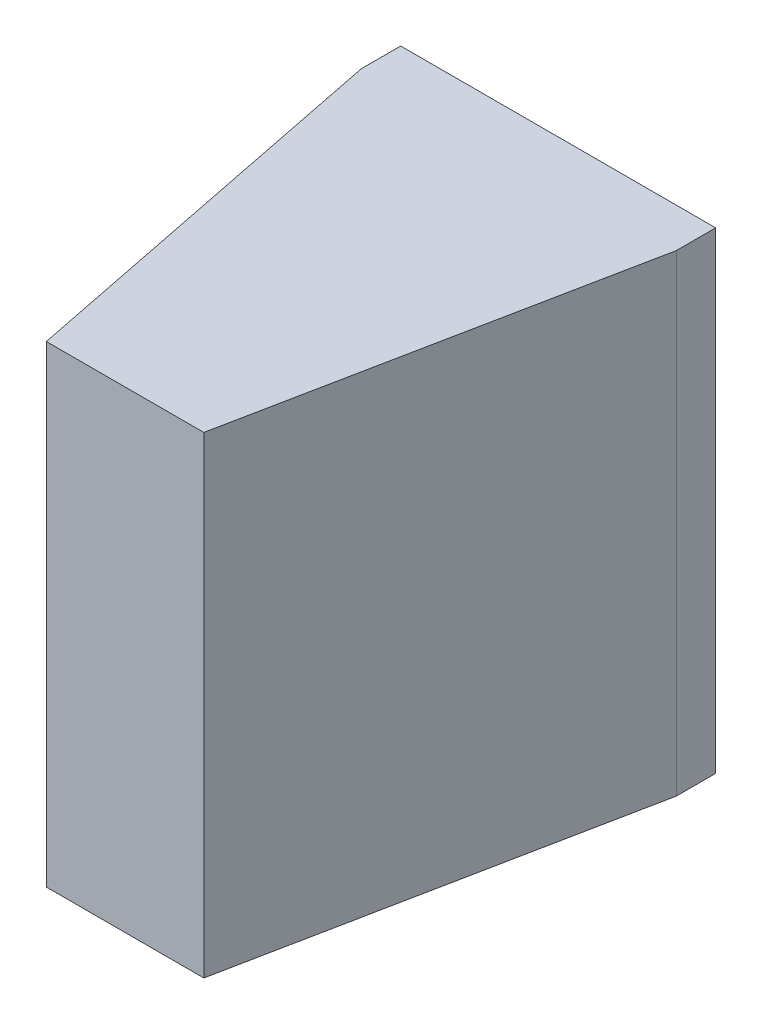
ISO-10303-21;
HEADER;
FILE_DESCRIPTION(('STEP AP214'),'2;1');
FILE_NAME('part.step','',(''),(''),'','','');
FILE_SCHEMA(('AUTOMOTIVE_DESIGN { 1 0 10303 214 1 1 1 1 }'));
ENDSEC;
DATA;
#1=APPLICATION_CONTEXT('core data for automotive mechanical design processes');
#2=APPLICATION_PROTOCOL_DEFINITION('international standard','automotive_design',2000,#1);
#3=PRODUCT_CONTEXT('',#1,'mechanical');
#4=PRODUCT('Part','Part','',(#3));
#5=PRODUCT_RELATED_PRODUCT_CATEGORY('part','',(#4));
#6=PRODUCT_DEFINITION_FORMATION('','',#4);
#7=PRODUCT_DEFINITION_CONTEXT('part definition',#1,'design');
#8=PRODUCT_DEFINITION('design','',#6,#7);
#9=PRODUCT_DEFINITION_SHAPE('','',#8);
#10=(LENGTH_UNIT() NAMED_UNIT(*) SI_UNIT(.MILLI.,.METRE.));
#11=(NAMED_UNIT(*) PLANE_ANGLE_UNIT() SI_UNIT($,.RADIAN.));
#12=(NAMED_UNIT(*) SI_UNIT($,.STERADIAN.) SOLID_ANGLE_UNIT());
#13=UNCERTAINTY_MEASURE_WITH_UNIT(LENGTH_MEASURE(1.E-05),#10,'distance_accuracy_value','');
#14=(GEOMETRIC_REPRESENTATION_CONTEXT(3) GLOBAL_UNCERTAINTY_ASSIGNED_CONTEXT((#13)) GLOBAL_UNIT_ASSIGNED_CONTEXT((#10,
#11,#12)) REPRESENTATION_CONTEXT('',''));
#15=CARTESIAN_POINT('',(0.,0.,0.));
#16=DIRECTION('',(0.,0.,1.));
#17=DIRECTION('',(1.,0.,0.));
#18=AXIS2_PLACEMENT_3D('',#15,#16,#17);
#19=CARTESIAN_POINT('',(40.,-60.,10.));
#20=DIRECTION('',(-1.,0.,0.));
#21=DIRECTION('',(0.,0.,1.));
#22=AXIS2_PLACEMENT_3D('',#19,#20,#21);
#23=PLANE('',#22);
#24=DIRECTION('',(0.,1.,0.));
#25=VECTOR('',#24,1.);
#26=CARTESIAN_POINT('',(40.,-60.,0.));
#27=LINE('',#26,#25);
#28=CARTESIAN_POINT('',(40.,-60.,0.));
#29=VERTEX_POINT('',#28);
#30=CARTESIAN_POINT('',(40.,60.,0.));
#31=VERTEX_POINT('',#30);
#32=EDGE_CURVE('E120',#29,#31,#27,.T.);
#33=ORIENTED_EDGE('',*,*,#32,.T.);
#34=DIRECTION('',(0.,0.,-1.));
#35=VECTOR('',#34,1.);
#36=CARTESIAN_POINT('',(40.,60.,10.));
#37=LINE('',#36,#35);
#38=CARTESIAN_POINT('',(40.,60.,10.));
#39=VERTEX_POINT('',#38);
#40=EDGE_CURVE('E11',#39,#31,#37,.T.);
#41=ORIENTED_EDGE('',*,*,#40,.F.);
#42=DIRECTION('',(0.,1.,0.));
#43=VECTOR('',#42,1.);
#44=CARTESIAN_POINT('',(40.,-60.,10.));
#45=LINE('',#44,#43);
#46=CARTESIAN_POINT('',(40.,-60.,9.99999999999999));
#47=VERTEX_POINT('',#46);
#48=EDGE_CURVE('E127',#47,#39,#45,.T.);
#49=ORIENTED_EDGE('',*,*,#48,.F.);
#50=DIRECTION('',(0.,0.,-1.));
#51=VECTOR('',#50,1.);
#52=CARTESIAN_POINT('',(40.,-60.,10.));
#53=LINE('',#52,#51);
#54=EDGE_CURVE('E131',#47,#29,#53,.T.);
#55=ORIENTED_EDGE('',*,*,#54,.T.);
#56=EDGE_LOOP('',(#33,#41,#49,#55));
#57=FACE_BOUND('',#56,.T.);
#58=ADVANCED_FACE('F39',(#57),#23,.F.);
#59=CARTESIAN_POINT('',(-40.,60.,10.));
#60=DIRECTION('',(0.,-1.,0.));
#61=DIRECTION('',(0.,0.,-1.));
#62=AXIS2_PLACEMENT_3D('',#59,#60,#61);
#63=PLANE('',#62);
#64=DIRECTION('',(-1.,0.,0.));
#65=VECTOR('',#64,1.);
#66=CARTESIAN_POINT('',(-40.,60.,0.));
#67=LINE('',#66,#65);
#68=CARTESIAN_POINT('',(-40.,60.,0.));
#69=VERTEX_POINT('',#68);
#70=EDGE_CURVE('E122',#31,#69,#67,.T.);
#71=ORIENTED_EDGE('',*,*,#70,.T.);
#72=DIRECTION('',(0.,0.,-1.));
#73=VECTOR('',#72,1.);
#74=CARTESIAN_POINT('',(-40.,60.,10.));
#75=LINE('',#74,#73);
#76=CARTESIAN_POINT('',(-40.,60.,10.));
#77=VERTEX_POINT('',#76);
#78=EDGE_CURVE('E47',#77,#69,#75,.T.);
#79=ORIENTED_EDGE('',*,*,#78,.F.);
#80=DIRECTION('',(0.196116135138184,0.,0.98058067569092));
#81=VECTOR('',#80,1.);
#82=CARTESIAN_POINT('',(-40.,60.,10.));
#83=LINE('',#82,#81);
#84=CARTESIAN_POINT('',(-20.,60.,110.));
#85=VERTEX_POINT('',#84);
#86=EDGE_CURVE('E110',#77,#85,#83,.T.);
#87=ORIENTED_EDGE('',*,*,#86,.T.);
#88=DIRECTION('',(1.,0.,0.));
#89=VECTOR('',#88,1.);
#90=CARTESIAN_POINT('',(-20.,60.,110.));
#91=LINE('',#90,#89);
#92=CARTESIAN_POINT('',(20.,60.,110.));
#93=VERTEX_POINT('',#92);
#94=EDGE_CURVE('E99',#85,#93,#91,.T.);
#95=ORIENTED_EDGE('',*,*,#94,.T.);
#96=DIRECTION('',(0.196116135138184,0.,-0.98058067569092));
#97=VECTOR('',#96,1.);
#98=CARTESIAN_POINT('',(40.,60.,9.99999999999999));
#99=LINE('',#98,#97);
#100=EDGE_CURVE('E109',#93,#39,#99,.T.);
#101=ORIENTED_EDGE('',*,*,#100,.T.);
#102=ORIENTED_EDGE('',*,*,#40,.T.);
#103=EDGE_LOOP('',(#71,#79,#87,#95,#101,#102));
#104=FACE_BOUND('',#103,.T.);
#105=ADVANCED_FACE('F113',(#104),#63,.F.);
#106=CARTESIAN_POINT('',(-40.,-60.,10.));
#107=DIRECTION('',(1.,0.,0.));
#108=DIRECTION('',(0.,0.,-1.));
#109=AXIS2_PLACEMENT_3D('',#106,#107,#108);
#110=PLANE('',#109);
#111=DIRECTION('',(0.,-1.,0.));
#112=VECTOR('',#111,1.);
#113=CARTESIAN_POINT('',(-40.,-60.,0.));
#114=LINE('',#113,#112);
#115=CARTESIAN_POINT('',(-40.,-60.,0.));
#116=VERTEX_POINT('',#115);
#117=EDGE_CURVE('E71',#69,#116,#114,.T.);
#118=ORIENTED_EDGE('',*,*,#117,.T.);
#119=DIRECTION('',(0.,0.,-1.));
#120=VECTOR('',#119,1.);
#121=CARTESIAN_POINT('',(-40.,-60.,10.));
#122=LINE('',#121,#120);
#123=CARTESIAN_POINT('',(-40.,-60.,10.));
#124=VERTEX_POINT('',#123);
#125=EDGE_CURVE('E55',#124,#116,#122,.T.);
#126=ORIENTED_EDGE('',*,*,#125,.F.);
#127=DIRECTION('',(0.,-1.,0.));
#128=VECTOR('',#127,1.);
#129=CARTESIAN_POINT('',(-40.,-60.,10.));
#130=LINE('',#129,#128);
#131=EDGE_CURVE('E130',#77,#124,#130,.T.);
#132=ORIENTED_EDGE('',*,*,#131,.F.);
#133=ORIENTED_EDGE('',*,*,#78,.T.);
#134=EDGE_LOOP('',(#118,#126,#132,#133));
#135=FACE_BOUND('',#134,.T.);
#136=ADVANCED_FACE('F137',(#135),#110,.F.);
#137=CARTESIAN_POINT('',(-40.,-60.,10.));
#138=DIRECTION('',(0.,1.,0.));
#139=DIRECTION('',(0.,0.,1.));
#140=AXIS2_PLACEMENT_3D('',#137,#138,#139);
#141=PLANE('',#140);
#142=DIRECTION('',(1.,0.,0.));
#143=VECTOR('',#142,1.);
#144=CARTESIAN_POINT('',(-40.,-60.,0.));
#145=LINE('',#144,#143);
#146=EDGE_CURVE('E76',#116,#29,#145,.T.);
#147=ORIENTED_EDGE('',*,*,#146,.T.);
#148=ORIENTED_EDGE('',*,*,#54,.F.);
#149=DIRECTION('',(0.196116135138184,0.,-0.98058067569092));
#150=VECTOR('',#149,1.);
#151=CARTESIAN_POINT('',(40.,-60.,9.99999999999999));
#152=LINE('',#151,#150);
#153=CARTESIAN_POINT('',(20.,-60.,110.));
#154=VERTEX_POINT('',#153);
#155=EDGE_CURVE('E115',#154,#47,#152,.T.);
#156=ORIENTED_EDGE('',*,*,#155,.F.);
#157=DIRECTION('',(1.,0.,0.));
#158=VECTOR('',#157,1.);
#159=CARTESIAN_POINT('',(-20.,-60.,110.));
#160=LINE('',#159,#158);
#161=CARTESIAN_POINT('',(-20.,-60.,110.));
#162=VERTEX_POINT('',#161);
#163=EDGE_CURVE('E146',#162,#154,#160,.T.);
#164=ORIENTED_EDGE('',*,*,#163,.F.);
#165=DIRECTION('',(0.196116135138184,0.,0.98058067569092));
#166=VECTOR('',#165,1.);
#167=CARTESIAN_POINT('',(-40.,-60.,10.));
#168=LINE('',#167,#166);
#169=EDGE_CURVE('E119',#124,#162,#168,.T.);
#170=ORIENTED_EDGE('',*,*,#169,.F.);
#171=ORIENTED_EDGE('',*,*,#125,.T.);
#172=EDGE_LOOP('',(#147,#148,#156,#164,#170,#171));
#173=FACE_BOUND('',#172,.T.);
#174=ADVANCED_FACE('F143',(#173),#141,.F.);
#175=CARTESIAN_POINT('',(0.,0.,0.));
#176=DIRECTION('',(0.,0.,-1.));
#177=DIRECTION('',(-1.,0.,0.));
#178=AXIS2_PLACEMENT_3D('',#175,#176,#177);
#179=PLANE('',#178);
#180=ORIENTED_EDGE('',*,*,#32,.F.);
#181=ORIENTED_EDGE('',*,*,#146,.F.);
#182=ORIENTED_EDGE('',*,*,#117,.F.);
#183=ORIENTED_EDGE('',*,*,#70,.F.);
#184=EDGE_LOOP('',(#180,#181,#182,#183));
#185=FACE_BOUND('',#184,.T.);
#186=ADVANCED_FACE('F140',(#185),#179,.T.);
#187=CARTESIAN_POINT('',(-40.,60.,10.));
#188=DIRECTION('',(0.98058067569092,0.,-0.196116135138184));
#189=DIRECTION('',(-0.196116135138184,0.,-0.98058067569092));
#190=AXIS2_PLACEMENT_3D('',#187,#188,#189);
#191=PLANE('',#190);
#192=ORIENTED_EDGE('',*,*,#169,.T.);
#193=DIRECTION('',(0.,-1.,0.));
#194=VECTOR('',#193,1.);
#195=CARTESIAN_POINT('',(-20.,60.,110.));
#196=LINE('',#195,#194);
#197=EDGE_CURVE('E103',#85,#162,#196,.T.);
#198=ORIENTED_EDGE('',*,*,#197,.F.);
#199=ORIENTED_EDGE('',*,*,#86,.F.);
#200=ORIENTED_EDGE('',*,*,#131,.T.);
#201=EDGE_LOOP('',(#192,#198,#199,#200));
#202=FACE_BOUND('',#201,.T.);
#203=ADVANCED_FACE('F117',(#202),#191,.F.);
#204=CARTESIAN_POINT('',(-20.,60.,110.));
#205=DIRECTION('',(0.,0.,-1.));
#206=DIRECTION('',(-1.,0.,0.));
#207=AXIS2_PLACEMENT_3D('',#204,#205,#206);
#208=PLANE('',#207);
#209=ORIENTED_EDGE('',*,*,#163,.T.);
#210=DIRECTION('',(0.,-1.,0.));
#211=VECTOR('',#210,1.);
#212=CARTESIAN_POINT('',(20.,60.,110.));
#213=LINE('',#212,#211);
#214=EDGE_CURVE('E106',#93,#154,#213,.T.);
#215=ORIENTED_EDGE('',*,*,#214,.F.);
#216=ORIENTED_EDGE('',*,*,#94,.F.);
#217=ORIENTED_EDGE('',*,*,#197,.T.);
#218=EDGE_LOOP('',(#209,#215,#216,#217));
#219=FACE_BOUND('',#218,.T.);
#220=ADVANCED_FACE('F101',(#219),#208,.F.);
#221=CARTESIAN_POINT('',(40.,60.,9.99999999999999));
#222=DIRECTION('',(-0.98058067569092,0.,-0.196116135138184));
#223=DIRECTION('',(-0.196116135138184,0.,0.98058067569092));
#224=AXIS2_PLACEMENT_3D('',#221,#222,#223);
#225=PLANE('',#224);
#226=ORIENTED_EDGE('',*,*,#155,.T.);
#227=ORIENTED_EDGE('',*,*,#48,.T.);
#228=ORIENTED_EDGE('',*,*,#100,.F.);
#229=ORIENTED_EDGE('',*,*,#214,.T.);
#230=EDGE_LOOP('',(#226,#227,#228,#229));
#231=FACE_BOUND('',#230,.T.);
#232=ADVANCED_FACE('F145',(#231),#225,.F.);
#233=CLOSED_SHELL('',(#58,#105,#136,#174,#186,#203,#220,#232));
#234=MANIFOLD_SOLID_BREP('B2',#233);
#235=ADVANCED_BREP_SHAPE_REPRESENTATION('',(#18,#234),#14);
#236=SHAPE_DEFINITION_REPRESENTATION(#9,#235);
ENDSEC;
END-ISO-10303-21;
